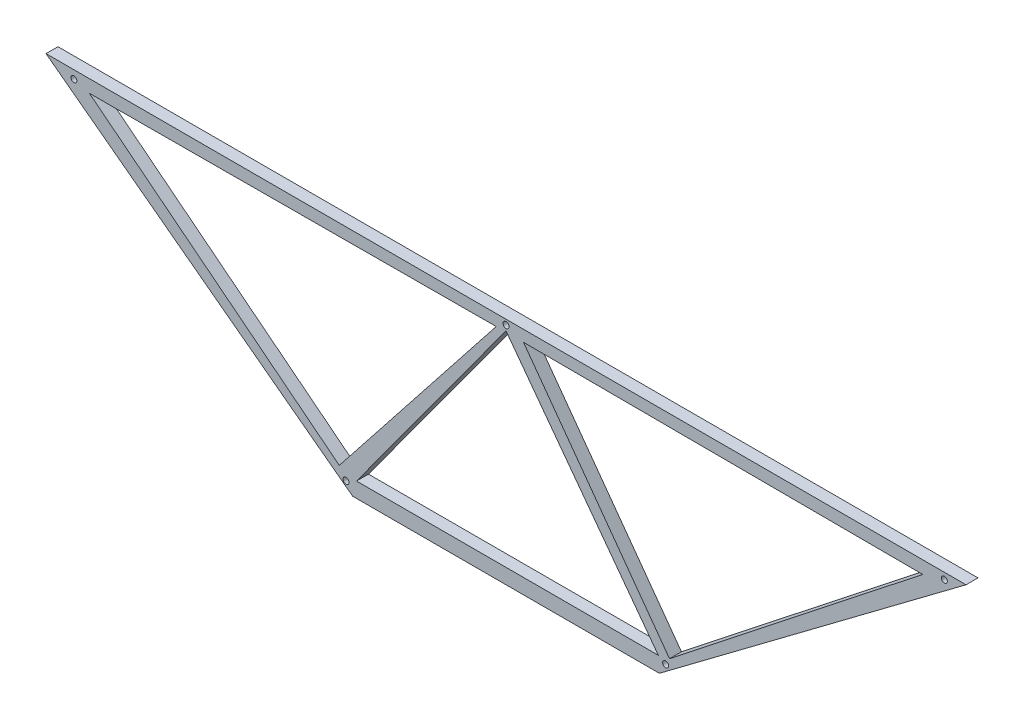
ISO-10303-21;
HEADER;
FILE_DESCRIPTION(('STEP AP214'),'2;1');
FILE_NAME('part.step','',(''),(''),'','','');
FILE_SCHEMA(('AUTOMOTIVE_DESIGN { 1 0 10303 214 1 1 1 1 }'));
ENDSEC;
DATA;
#1=APPLICATION_CONTEXT('core data for automotive mechanical design processes');
#2=APPLICATION_PROTOCOL_DEFINITION('international standard','automotive_design',2000,#1);
#3=PRODUCT_CONTEXT('',#1,'mechanical');
#4=PRODUCT('Part','Part','',(#3));
#5=PRODUCT_RELATED_PRODUCT_CATEGORY('part','',(#4));
#6=PRODUCT_DEFINITION_FORMATION('','',#4);
#7=PRODUCT_DEFINITION_CONTEXT('part definition',#1,'design');
#8=PRODUCT_DEFINITION('design','',#6,#7);
#9=PRODUCT_DEFINITION_SHAPE('','',#8);
#10=(LENGTH_UNIT() NAMED_UNIT(*) SI_UNIT(.MILLI.,.METRE.));
#11=(NAMED_UNIT(*) PLANE_ANGLE_UNIT() SI_UNIT($,.RADIAN.));
#12=(NAMED_UNIT(*) SI_UNIT($,.STERADIAN.) SOLID_ANGLE_UNIT());
#13=UNCERTAINTY_MEASURE_WITH_UNIT(LENGTH_MEASURE(1.E-05),#10,'distance_accuracy_value','');
#14=(GEOMETRIC_REPRESENTATION_CONTEXT(3) GLOBAL_UNCERTAINTY_ASSIGNED_CONTEXT((#13)) GLOBAL_UNIT_ASSIGNED_CONTEXT((#10,
#11,#12)) REPRESENTATION_CONTEXT('',''));
#15=CARTESIAN_POINT('',(0.,0.,0.));
#16=DIRECTION('',(0.,0.,1.));
#17=DIRECTION('',(1.,0.,0.));
#18=AXIS2_PLACEMENT_3D('',#15,#16,#17);
#19=CARTESIAN_POINT('',(200.,-1.02726413272794E-13,15.61));
#20=DIRECTION('',(-0.600000000000001,0.8,0.));
#21=DIRECTION('',(-0.8,-0.600000000000001,0.));
#22=AXIS2_PLACEMENT_3D('',#19,#20,#21);
#23=PLANE('',#22);
#24=DIRECTION('',(0.8,0.6,0.));
#25=VECTOR('',#24,1.);
#26=CARTESIAN_POINT('',(200.,-1.02726413272794E-13,0.));
#27=LINE('',#26,#25);
#28=CARTESIAN_POINT('',(200.,-1.02726413272794E-13,0.));
#29=VERTEX_POINT('',#28);
#30=CARTESIAN_POINT('',(600.,300.,0.));
#31=VERTEX_POINT('',#30);
#32=EDGE_CURVE('E209',#29,#31,#27,.T.);
#33=ORIENTED_EDGE('',*,*,#32,.T.);
#34=DIRECTION('',(0.,0.,-1.));
#35=VECTOR('',#34,1.);
#36=CARTESIAN_POINT('',(600.,300.,15.61));
#37=LINE('',#36,#35);
#38=CARTESIAN_POINT('',(600.,300.,15.61));
#39=VERTEX_POINT('',#38);
#40=EDGE_CURVE('E11',#39,#31,#37,.T.);
#41=ORIENTED_EDGE('',*,*,#40,.F.);
#42=DIRECTION('',(0.8,0.6,0.));
#43=VECTOR('',#42,1.);
#44=CARTESIAN_POINT('',(200.,-1.02726413272794E-13,15.61));
#45=LINE('',#44,#43);
#46=CARTESIAN_POINT('',(200.,-1.02726413272794E-13,15.61));
#47=VERTEX_POINT('',#46);
#48=EDGE_CURVE('E211',#47,#39,#45,.T.);
#49=ORIENTED_EDGE('',*,*,#48,.F.);
#50=DIRECTION('',(0.,0.,-1.));
#51=VECTOR('',#50,1.);
#52=CARTESIAN_POINT('',(200.,-1.02726413272794E-13,15.61));
#53=LINE('',#52,#51);
#54=EDGE_CURVE('E223',#47,#29,#53,.T.);
#55=ORIENTED_EDGE('',*,*,#54,.T.);
#56=EDGE_LOOP('',(#33,#41,#49,#55));
#57=FACE_BOUND('',#56,.T.);
#58=ADVANCED_FACE('F39',(#57),#23,.F.);
#59=CARTESIAN_POINT('',(600.,300.,15.61));
#60=DIRECTION('',(0.,-1.,0.));
#61=DIRECTION('',(1.,0.,0.));
#62=AXIS2_PLACEMENT_3D('',#59,#60,#61);
#63=PLANE('',#62);
#64=DIRECTION('',(-1.,0.,0.));
#65=VECTOR('',#64,1.);
#66=CARTESIAN_POINT('',(600.,300.,0.));
#67=LINE('',#66,#65);
#68=CARTESIAN_POINT('',(-600.,300.,0.));
#69=VERTEX_POINT('',#68);
#70=EDGE_CURVE('E227',#31,#69,#67,.T.);
#71=ORIENTED_EDGE('',*,*,#70,.T.);
#72=DIRECTION('',(0.,0.,-1.));
#73=VECTOR('',#72,1.);
#74=CARTESIAN_POINT('',(-600.,300.,15.61));
#75=LINE('',#74,#73);
#76=CARTESIAN_POINT('',(-600.,300.,15.61));
#77=VERTEX_POINT('',#76);
#78=EDGE_CURVE('E46',#77,#69,#75,.T.);
#79=ORIENTED_EDGE('',*,*,#78,.F.);
#80=DIRECTION('',(-1.,0.,0.));
#81=VECTOR('',#80,1.);
#82=CARTESIAN_POINT('',(600.,300.,15.61));
#83=LINE('',#82,#81);
#84=EDGE_CURVE('E219',#39,#77,#83,.T.);
#85=ORIENTED_EDGE('',*,*,#84,.F.);
#86=ORIENTED_EDGE('',*,*,#40,.T.);
#87=EDGE_LOOP('',(#71,#79,#85,#86));
#88=FACE_BOUND('',#87,.T.);
#89=ADVANCED_FACE('F257',(#88),#63,.F.);
#90=CARTESIAN_POINT('',(-600.,300.,15.61));
#91=DIRECTION('',(0.6,0.8,0.));
#92=DIRECTION('',(-0.8,0.6,0.));
#93=AXIS2_PLACEMENT_3D('',#90,#91,#92);
#94=PLANE('',#93);
#95=DIRECTION('',(0.8,-0.6,0.));
#96=VECTOR('',#95,1.);
#97=CARTESIAN_POINT('',(-600.,300.,0.));
#98=LINE('',#97,#96);
#99=CARTESIAN_POINT('',(-200.,0.,0.));
#100=VERTEX_POINT('',#99);
#101=EDGE_CURVE('E230',#69,#100,#98,.T.);
#102=ORIENTED_EDGE('',*,*,#101,.T.);
#103=DIRECTION('',(0.,0.,-1.));
#104=VECTOR('',#103,1.);
#105=CARTESIAN_POINT('',(-200.,0.,15.61));
#106=LINE('',#105,#104);
#107=CARTESIAN_POINT('',(-200.,0.,15.61));
#108=VERTEX_POINT('',#107);
#109=EDGE_CURVE('E234',#108,#100,#106,.T.);
#110=ORIENTED_EDGE('',*,*,#109,.F.);
#111=DIRECTION('',(0.8,-0.6,0.));
#112=VECTOR('',#111,1.);
#113=CARTESIAN_POINT('',(-600.,300.,15.61));
#114=LINE('',#113,#112);
#115=EDGE_CURVE('E216',#77,#108,#114,.T.);
#116=ORIENTED_EDGE('',*,*,#115,.F.);
#117=ORIENTED_EDGE('',*,*,#78,.T.);
#118=EDGE_LOOP('',(#102,#110,#116,#117));
#119=FACE_BOUND('',#118,.T.);
#120=ADVANCED_FACE('F241',(#119),#94,.F.);
#121=CARTESIAN_POINT('',(-200.,0.,15.61));
#122=DIRECTION('',(0.,1.,0.));
#123=DIRECTION('',(-1.,0.,0.));
#124=AXIS2_PLACEMENT_3D('',#121,#122,#123);
#125=PLANE('',#124);
#126=DIRECTION('',(1.,0.,0.));
#127=VECTOR('',#126,1.);
#128=CARTESIAN_POINT('',(-200.,0.,0.));
#129=LINE('',#128,#127);
#130=EDGE_CURVE('E217',#100,#29,#129,.T.);
#131=ORIENTED_EDGE('',*,*,#130,.T.);
#132=ORIENTED_EDGE('',*,*,#54,.F.);
#133=DIRECTION('',(1.,0.,0.));
#134=VECTOR('',#133,1.);
#135=CARTESIAN_POINT('',(-200.,0.,15.61));
#136=LINE('',#135,#134);
#137=EDGE_CURVE('E221',#108,#47,#136,.T.);
#138=ORIENTED_EDGE('',*,*,#137,.F.);
#139=ORIENTED_EDGE('',*,*,#109,.T.);
#140=EDGE_LOOP('',(#131,#132,#138,#139));
#141=FACE_BOUND('',#140,.T.);
#142=ADVANCED_FACE('F248',(#141),#125,.F.);
#143=CARTESIAN_POINT('',(0.,0.,15.61));
#144=DIRECTION('',(0.,0.,-1.));
#145=DIRECTION('',(-1.,0.,0.));
#146=AXIS2_PLACEMENT_3D('',#143,#144,#145);
#147=PLANE('',#146);
#148=CARTESIAN_POINT('',(-563.626982451195,289.376274745277,15.61));
#149=DIRECTION('',(0.,0.,1.));
#150=DIRECTION('',(1.,0.,0.));
#151=AXIS2_PLACEMENT_3D('',#148,#149,#150);
#152=CIRCLE('',#151,3.89999999999983);
#153=CARTESIAN_POINT('',(-559.726982451196,289.376274745277,15.61));
#154=VERTEX_POINT('',#153);
#155=EDGE_CURVE('E330',#154,#154,#152,.T.);
#156=ORIENTED_EDGE('',*,*,#155,.F.);
#157=EDGE_LOOP('',(#156));
#158=FACE_BOUND('',#157,.T.);
#159=CARTESIAN_POINT('',(-208.717094574376,13.0755215010745,15.61));
#160=DIRECTION('',(0.,0.,1.));
#161=DIRECTION('',(1.,0.,0.));
#162=AXIS2_PLACEMENT_3D('',#159,#160,#161);
#163=CIRCLE('',#162,3.9);
#164=CARTESIAN_POINT('',(-204.817094574376,13.0755215010745,15.61));
#165=VERTEX_POINT('',#164);
#166=EDGE_CURVE('E344',#165,#165,#163,.T.);
#167=ORIENTED_EDGE('',*,*,#166,.F.);
#168=EDGE_LOOP('',(#167));
#169=FACE_BOUND('',#168,.T.);
#170=CARTESIAN_POINT('',(571.769930614709,291.724280099086,15.61));
#171=DIRECTION('',(0.,0.,1.));
#172=DIRECTION('',(1.,0.,0.));
#173=AXIS2_PLACEMENT_3D('',#170,#171,#172);
#174=CIRCLE('',#173,3.90000000000006);
#175=CARTESIAN_POINT('',(575.669930614709,291.724280099086,15.61));
#176=VERTEX_POINT('',#175);
#177=EDGE_CURVE('E340',#176,#176,#174,.T.);
#178=ORIENTED_EDGE('',*,*,#177,.F.);
#179=EDGE_LOOP('',(#178));
#180=FACE_BOUND('',#179,.T.);
#181=CARTESIAN_POINT('',(208.154539122281,14.2672478103547,15.61));
#182=DIRECTION('',(0.,0.,1.));
#183=DIRECTION('',(1.,0.,0.));
#184=AXIS2_PLACEMENT_3D('',#181,#182,#183);
#185=CIRCLE('',#184,3.9);
#186=CARTESIAN_POINT('',(212.054539122281,14.2672478103547,15.61));
#187=VERTEX_POINT('',#186);
#188=EDGE_CURVE('E346',#187,#187,#185,.T.);
#189=ORIENTED_EDGE('',*,*,#188,.F.);
#190=EDGE_LOOP('',(#189));
#191=FACE_BOUND('',#190,.T.);
#192=CARTESIAN_POINT('',(-1.08576890578373E-13,293.392106369885,15.61));
#193=DIRECTION('',(0.,0.,1.));
#194=DIRECTION('',(1.,0.,0.));
#195=AXIS2_PLACEMENT_3D('',#192,#193,#194);
#196=CIRCLE('',#195,3.9);
#197=CARTESIAN_POINT('',(3.8999999999999,293.392106369885,15.61));
#198=VERTEX_POINT('',#197);
#199=EDGE_CURVE('E326',#198,#198,#196,.T.);
#200=ORIENTED_EDGE('',*,*,#199,.F.);
#201=EDGE_LOOP('',(#200));
#202=FACE_BOUND('',#201,.T.);
#203=DIRECTION('',(0.619658846601666,0.784871272138491,0.));
#204=VECTOR('',#203,1.);
#205=CARTESIAN_POINT('',(-217.434189148752,26.151043002149,15.61));
#206=LINE('',#205,#204);
#207=CARTESIAN_POINT('',(-217.434189148752,26.151043002149,15.61));
#208=VERTEX_POINT('',#207);
#209=CARTESIAN_POINT('',(-12.8102827276835,285.331439801828,15.61));
#210=VERTEX_POINT('',#209);
#211=EDGE_CURVE('E155',#208,#210,#206,.T.);
#212=ORIENTED_EDGE('',*,*,#211,.F.);
#213=DIRECTION('',(0.784871272138491,-0.619658846601666,0.));
#214=VECTOR('',#213,1.);
#215=CARTESIAN_POINT('',(-543.331948451676,283.448560198172,15.61));
#216=LINE('',#215,#214);
#217=CARTESIAN_POINT('',(-543.331948451676,283.448560198172,15.61));
#218=VERTEX_POINT('',#217);
#219=EDGE_CURVE('E52',#218,#208,#216,.T.);
#220=ORIENTED_EDGE('',*,*,#219,.F.);
#221=DIRECTION('',(-0.999993701969575,-0.00354908737356482,0.));
#222=VECTOR('',#221,1.);
#223=CARTESIAN_POINT('',(-12.8102827276835,285.331439801828,15.61));
#224=LINE('',#223,#222);
#225=EDGE_CURVE('E153',#210,#218,#224,.T.);
#226=ORIENTED_EDGE('',*,*,#225,.F.);
#227=EDGE_LOOP('',(#212,#220,#226));
#228=FACE_BOUND('',#227,.T.);
#229=DIRECTION('',(0.78543290200862,0.61894681228868,0.));
#230=VECTOR('',#229,1.);
#231=CARTESIAN_POINT('',(213.236522938282,23.1587279276047,15.61));
#232=LINE('',#231,#230);
#233=CARTESIAN_POINT('',(213.236522938282,23.1587279276048,15.61));
#234=VERTEX_POINT('',#233);
#235=CARTESIAN_POINT('',(543.539861229419,283.448560198172,15.61));
#236=VERTEX_POINT('',#235);
#237=EDGE_CURVE('E178',#234,#236,#232,.T.);
#238=ORIENTED_EDGE('',*,*,#237,.F.);
#239=DIRECTION('',(0.587591805673342,-0.809157506240622,0.));
#240=VECTOR('',#239,1.);
#241=CARTESIAN_POINT('',(22.8526533203921,285.331439801828,15.61));
#242=LINE('',#241,#240);
#243=CARTESIAN_POINT('',(22.8526533203921,285.331439801828,15.61));
#244=VERTEX_POINT('',#243);
#245=EDGE_CURVE('E62',#244,#234,#242,.T.);
#246=ORIENTED_EDGE('',*,*,#245,.F.);
#247=DIRECTION('',(-0.999993461817624,0.00361611974415042,0.));
#248=VECTOR('',#247,1.);
#249=CARTESIAN_POINT('',(543.539861229419,283.448560198172,15.61));
#250=LINE('',#249,#248);
#251=EDGE_CURVE('E174',#236,#244,#250,.T.);
#252=ORIENTED_EDGE('',*,*,#251,.F.);
#253=EDGE_LOOP('',(#238,#246,#252));
#254=FACE_BOUND('',#253,.T.);
#255=DIRECTION('',(1.,0.,0.));
#256=VECTOR('',#255,1.);
#257=CARTESIAN_POINT('',(-195.,19.6783080925826,15.61));
#258=LINE('',#257,#256);
#259=CARTESIAN_POINT('',(-195.,19.6783080925826,15.61));
#260=VERTEX_POINT('',#259);
#261=CARTESIAN_POINT('',(198.687304149753,19.6783080925826,15.61));
#262=VERTEX_POINT('',#261);
#263=EDGE_CURVE('E201',#260,#262,#258,.T.);
#264=ORIENTED_EDGE('',*,*,#263,.F.);
#265=DIRECTION('',(-0.589636534369051,-0.807668717567577,0.));
#266=VECTOR('',#265,1.);
#267=CARTESIAN_POINT('',(-1.06131478694231E-13,286.78421273977,15.61));
#268=LINE('',#267,#266);
#269=CARTESIAN_POINT('',(-1.06131478694231E-13,286.78421273977,15.61));
#270=VERTEX_POINT('',#269);
#271=EDGE_CURVE('E164',#270,#260,#268,.T.);
#272=ORIENTED_EDGE('',*,*,#271,.F.);
#273=DIRECTION('',(-0.596838342494344,0.802361510124087,0.));
#274=VECTOR('',#273,1.);
#275=CARTESIAN_POINT('',(198.687304149753,19.6783080925826,15.61));
#276=LINE('',#275,#274);
#277=EDGE_CURVE('E191',#262,#270,#276,.T.);
#278=ORIENTED_EDGE('',*,*,#277,.F.);
#279=EDGE_LOOP('',(#264,#272,#278));
#280=FACE_BOUND('',#279,.T.);
#281=ORIENTED_EDGE('',*,*,#48,.T.);
#282=ORIENTED_EDGE('',*,*,#84,.T.);
#283=ORIENTED_EDGE('',*,*,#115,.T.);
#284=ORIENTED_EDGE('',*,*,#137,.T.);
#285=EDGE_LOOP('',(#281,#282,#283,#284));
#286=FACE_BOUND('',#285,.T.);
#287=ADVANCED_FACE('F253',(#158,#169,#180,#191,#202,#228,#254,#280,#286),#147,.F.);
#288=CARTESIAN_POINT('',(0.,0.,0.));
#289=DIRECTION('',(0.,0.,-1.));
#290=DIRECTION('',(-1.,0.,0.));
#291=AXIS2_PLACEMENT_3D('',#288,#289,#290);
#292=PLANE('',#291);
#293=CARTESIAN_POINT('',(-563.626982451195,289.376274745277,0.));
#294=DIRECTION('',(0.,0.,1.));
#295=DIRECTION('',(1.,0.,0.));
#296=AXIS2_PLACEMENT_3D('',#293,#294,#295);
#297=CIRCLE('',#296,3.89999999999983);
#298=CARTESIAN_POINT('',(-559.726982451196,289.376274745277,0.));
#299=VERTEX_POINT('',#298);
#300=EDGE_CURVE('E172',#299,#299,#297,.T.);
#301=ORIENTED_EDGE('',*,*,#300,.T.);
#302=EDGE_LOOP('',(#301));
#303=FACE_BOUND('',#302,.T.);
#304=CARTESIAN_POINT('',(-208.717094574376,13.0755215010745,0.));
#305=DIRECTION('',(0.,0.,1.));
#306=DIRECTION('',(1.,0.,0.));
#307=AXIS2_PLACEMENT_3D('',#304,#305,#306);
#308=CIRCLE('',#307,3.9);
#309=CARTESIAN_POINT('',(-204.817094574376,13.0755215010745,0.));
#310=VERTEX_POINT('',#309);
#311=EDGE_CURVE('E348',#310,#310,#308,.T.);
#312=ORIENTED_EDGE('',*,*,#311,.T.);
#313=EDGE_LOOP('',(#312));
#314=FACE_BOUND('',#313,.T.);
#315=CARTESIAN_POINT('',(571.769930614709,291.724280099086,0.));
#316=DIRECTION('',(0.,0.,1.));
#317=DIRECTION('',(1.,0.,0.));
#318=AXIS2_PLACEMENT_3D('',#315,#316,#317);
#319=CIRCLE('',#318,3.90000000000006);
#320=CARTESIAN_POINT('',(575.669930614709,291.724280099086,0.));
#321=VERTEX_POINT('',#320);
#322=EDGE_CURVE('E338',#321,#321,#319,.T.);
#323=ORIENTED_EDGE('',*,*,#322,.T.);
#324=EDGE_LOOP('',(#323));
#325=FACE_BOUND('',#324,.T.);
#326=CARTESIAN_POINT('',(208.154539122281,14.2672478103547,0.));
#327=DIRECTION('',(0.,0.,1.));
#328=DIRECTION('',(1.,0.,0.));
#329=AXIS2_PLACEMENT_3D('',#326,#327,#328);
#330=CIRCLE('',#329,3.9);
#331=CARTESIAN_POINT('',(212.054539122281,14.2672478103547,0.));
#332=VERTEX_POINT('',#331);
#333=EDGE_CURVE('E156',#332,#332,#330,.T.);
#334=ORIENTED_EDGE('',*,*,#333,.T.);
#335=EDGE_LOOP('',(#334));
#336=FACE_BOUND('',#335,.T.);
#337=CARTESIAN_POINT('',(-1.08576890578373E-13,293.392106369885,0.));
#338=DIRECTION('',(0.,0.,1.));
#339=DIRECTION('',(1.,0.,0.));
#340=AXIS2_PLACEMENT_3D('',#337,#338,#339);
#341=CIRCLE('',#340,3.9);
#342=CARTESIAN_POINT('',(3.8999999999999,293.392106369885,0.));
#343=VERTEX_POINT('',#342);
#344=EDGE_CURVE('E333',#343,#343,#341,.T.);
#345=ORIENTED_EDGE('',*,*,#344,.T.);
#346=EDGE_LOOP('',(#345));
#347=FACE_BOUND('',#346,.T.);
#348=DIRECTION('',(0.784871272138491,-0.619658846601666,0.));
#349=VECTOR('',#348,1.);
#350=CARTESIAN_POINT('',(-543.331948451676,283.448560198172,0.));
#351=LINE('',#350,#349);
#352=CARTESIAN_POINT('',(-543.331948451676,283.448560198172,0.));
#353=VERTEX_POINT('',#352);
#354=CARTESIAN_POINT('',(-217.434189148752,26.151043002149,0.));
#355=VERTEX_POINT('',#354);
#356=EDGE_CURVE('E131',#353,#355,#351,.T.);
#357=ORIENTED_EDGE('',*,*,#356,.T.);
#358=DIRECTION('',(0.619658846601666,0.784871272138491,0.));
#359=VECTOR('',#358,1.);
#360=CARTESIAN_POINT('',(-217.434189148752,26.151043002149,0.));
#361=LINE('',#360,#359);
#362=CARTESIAN_POINT('',(-12.8102827276836,285.331439801828,0.));
#363=VERTEX_POINT('',#362);
#364=EDGE_CURVE('E143',#355,#363,#361,.T.);
#365=ORIENTED_EDGE('',*,*,#364,.T.);
#366=DIRECTION('',(-0.999993701969575,-0.00354908737356482,0.));
#367=VECTOR('',#366,1.);
#368=CARTESIAN_POINT('',(-12.8102827276835,285.331439801828,0.));
#369=LINE('',#368,#367);
#370=EDGE_CURVE('E142',#363,#353,#369,.T.);
#371=ORIENTED_EDGE('',*,*,#370,.T.);
#372=EDGE_LOOP('',(#357,#365,#371));
#373=FACE_BOUND('',#372,.T.);
#374=DIRECTION('',(0.587591805673342,-0.809157506240622,0.));
#375=VECTOR('',#374,1.);
#376=CARTESIAN_POINT('',(22.8526533203921,285.331439801828,0.));
#377=LINE('',#376,#375);
#378=CARTESIAN_POINT('',(22.8526533203921,285.331439801828,0.));
#379=VERTEX_POINT('',#378);
#380=CARTESIAN_POINT('',(213.236522938282,23.1587279276047,0.));
#381=VERTEX_POINT('',#380);
#382=EDGE_CURVE('E177',#379,#381,#377,.T.);
#383=ORIENTED_EDGE('',*,*,#382,.T.);
#384=DIRECTION('',(0.78543290200862,0.61894681228868,0.));
#385=VECTOR('',#384,1.);
#386=CARTESIAN_POINT('',(213.236522938282,23.1587279276047,0.));
#387=LINE('',#386,#385);
#388=CARTESIAN_POINT('',(543.539861229419,283.448560198172,0.));
#389=VERTEX_POINT('',#388);
#390=EDGE_CURVE('E184',#381,#389,#387,.T.);
#391=ORIENTED_EDGE('',*,*,#390,.T.);
#392=DIRECTION('',(-0.999993461817624,0.00361611974415042,0.));
#393=VECTOR('',#392,1.);
#394=CARTESIAN_POINT('',(543.539861229419,283.448560198172,0.));
#395=LINE('',#394,#393);
#396=EDGE_CURVE('E169',#389,#379,#395,.T.);
#397=ORIENTED_EDGE('',*,*,#396,.T.);
#398=EDGE_LOOP('',(#383,#391,#397));
#399=FACE_BOUND('',#398,.T.);
#400=DIRECTION('',(-0.589636534369051,-0.807668717567577,0.));
#401=VECTOR('',#400,1.);
#402=CARTESIAN_POINT('',(-1.06131478694231E-13,286.78421273977,0.));
#403=LINE('',#402,#401);
#404=CARTESIAN_POINT('',(-1.06131478694231E-13,286.78421273977,0.));
#405=VERTEX_POINT('',#404);
#406=CARTESIAN_POINT('',(-195.,19.6783080925826,0.));
#407=VERTEX_POINT('',#406);
#408=EDGE_CURVE('E188',#405,#407,#403,.T.);
#409=ORIENTED_EDGE('',*,*,#408,.T.);
#410=DIRECTION('',(1.,0.,0.));
#411=VECTOR('',#410,1.);
#412=CARTESIAN_POINT('',(-195.,19.6783080925826,0.));
#413=LINE('',#412,#411);
#414=CARTESIAN_POINT('',(198.687304149753,19.6783080925826,0.));
#415=VERTEX_POINT('',#414);
#416=EDGE_CURVE('E194',#407,#415,#413,.T.);
#417=ORIENTED_EDGE('',*,*,#416,.T.);
#418=DIRECTION('',(-0.596838342494344,0.802361510124087,0.));
#419=VECTOR('',#418,1.);
#420=CARTESIAN_POINT('',(198.687304149753,19.6783080925826,0.));
#421=LINE('',#420,#419);
#422=EDGE_CURVE('E199',#415,#405,#421,.T.);
#423=ORIENTED_EDGE('',*,*,#422,.T.);
#424=EDGE_LOOP('',(#409,#417,#423));
#425=FACE_BOUND('',#424,.T.);
#426=ORIENTED_EDGE('',*,*,#32,.F.);
#427=ORIENTED_EDGE('',*,*,#130,.F.);
#428=ORIENTED_EDGE('',*,*,#101,.F.);
#429=ORIENTED_EDGE('',*,*,#70,.F.);
#430=EDGE_LOOP('',(#426,#427,#428,#429));
#431=FACE_BOUND('',#430,.T.);
#432=ADVANCED_FACE('F146',(#303,#314,#325,#336,#347,#373,#399,#425,#431),#292,.T.);
#433=CARTESIAN_POINT('',(-1.06131478694231E-13,286.78421273977,0.));
#434=DIRECTION('',(-0.807668717567578,0.589636534369051,0.));
#435=DIRECTION('',(-0.589636534369051,-0.807668717567578,0.));
#436=AXIS2_PLACEMENT_3D('',#433,#434,#435);
#437=PLANE('',#436);
#438=ORIENTED_EDGE('',*,*,#271,.T.);
#439=DIRECTION('',(0.,0.,1.));
#440=VECTOR('',#439,1.);
#441=CARTESIAN_POINT('',(-195.,19.6783080925826,0.));
#442=LINE('',#441,#440);
#443=EDGE_CURVE('E196',#407,#260,#442,.T.);
#444=ORIENTED_EDGE('',*,*,#443,.F.);
#445=ORIENTED_EDGE('',*,*,#408,.F.);
#446=DIRECTION('',(0.,0.,1.));
#447=VECTOR('',#446,1.);
#448=CARTESIAN_POINT('',(-1.06131478694231E-13,286.78421273977,0.));
#449=LINE('',#448,#447);
#450=EDGE_CURVE('E210',#405,#270,#449,.T.);
#451=ORIENTED_EDGE('',*,*,#450,.T.);
#452=EDGE_LOOP('',(#438,#444,#445,#451));
#453=FACE_BOUND('',#452,.T.);
#454=ADVANCED_FACE('F270',(#453),#437,.F.);
#455=CARTESIAN_POINT('',(198.687304149753,19.6783080925826,0.));
#456=DIRECTION('',(0.802361510124087,0.596838342494344,0.));
#457=DIRECTION('',(-0.596838342494344,0.802361510124087,0.));
#458=AXIS2_PLACEMENT_3D('',#455,#456,#457);
#459=PLANE('',#458);
#460=ORIENTED_EDGE('',*,*,#277,.T.);
#461=ORIENTED_EDGE('',*,*,#450,.F.);
#462=ORIENTED_EDGE('',*,*,#422,.F.);
#463=DIRECTION('',(0.,0.,1.));
#464=VECTOR('',#463,1.);
#465=CARTESIAN_POINT('',(198.687304149753,19.6783080925826,0.));
#466=LINE('',#465,#464);
#467=EDGE_CURVE('E208',#415,#262,#466,.T.);
#468=ORIENTED_EDGE('',*,*,#467,.T.);
#469=EDGE_LOOP('',(#460,#461,#462,#468));
#470=FACE_BOUND('',#469,.T.);
#471=ADVANCED_FACE('F273',(#470),#459,.F.);
#472=CARTESIAN_POINT('',(-195.,19.6783080925826,0.));
#473=DIRECTION('',(0.,-1.,0.));
#474=DIRECTION('',(1.,0.,0.));
#475=AXIS2_PLACEMENT_3D('',#472,#473,#474);
#476=PLANE('',#475);
#477=ORIENTED_EDGE('',*,*,#263,.T.);
#478=ORIENTED_EDGE('',*,*,#467,.F.);
#479=ORIENTED_EDGE('',*,*,#416,.F.);
#480=ORIENTED_EDGE('',*,*,#443,.T.);
#481=EDGE_LOOP('',(#477,#478,#479,#480));
#482=FACE_BOUND('',#481,.T.);
#483=ADVANCED_FACE('F280',(#482),#476,.F.);
#484=CARTESIAN_POINT('',(22.8526533203921,285.331439801828,0.));
#485=DIRECTION('',(-0.809157506240622,-0.587591805673342,0.));
#486=DIRECTION('',(0.587591805673342,-0.809157506240622,0.));
#487=AXIS2_PLACEMENT_3D('',#484,#485,#486);
#488=PLANE('',#487);
#489=ORIENTED_EDGE('',*,*,#245,.T.);
#490=DIRECTION('',(0.,0.,1.));
#491=VECTOR('',#490,1.);
#492=CARTESIAN_POINT('',(213.236522938282,23.1587279276047,0.));
#493=LINE('',#492,#491);
#494=EDGE_CURVE('E170',#381,#234,#493,.T.);
#495=ORIENTED_EDGE('',*,*,#494,.F.);
#496=ORIENTED_EDGE('',*,*,#382,.F.);
#497=DIRECTION('',(0.,0.,1.));
#498=VECTOR('',#497,1.);
#499=CARTESIAN_POINT('',(22.8526533203921,285.331439801828,0.));
#500=LINE('',#499,#498);
#501=EDGE_CURVE('E175',#379,#244,#500,.T.);
#502=ORIENTED_EDGE('',*,*,#501,.T.);
#503=EDGE_LOOP('',(#489,#495,#496,#502));
#504=FACE_BOUND('',#503,.T.);
#505=ADVANCED_FACE('F278',(#504),#488,.F.);
#506=CARTESIAN_POINT('',(543.539861229419,283.448560198172,0.));
#507=DIRECTION('',(0.00361611974415042,0.999993461817624,0.));
#508=DIRECTION('',(-0.999993461817624,0.00361611974415042,0.));
#509=AXIS2_PLACEMENT_3D('',#506,#507,#508);
#510=PLANE('',#509);
#511=ORIENTED_EDGE('',*,*,#251,.T.);
#512=ORIENTED_EDGE('',*,*,#501,.F.);
#513=ORIENTED_EDGE('',*,*,#396,.F.);
#514=DIRECTION('',(0.,0.,1.));
#515=VECTOR('',#514,1.);
#516=CARTESIAN_POINT('',(543.539861229419,283.448560198172,0.));
#517=LINE('',#516,#515);
#518=EDGE_CURVE('E167',#389,#236,#517,.T.);
#519=ORIENTED_EDGE('',*,*,#518,.T.);
#520=EDGE_LOOP('',(#511,#512,#513,#519));
#521=FACE_BOUND('',#520,.T.);
#522=ADVANCED_FACE('F281',(#521),#510,.F.);
#523=CARTESIAN_POINT('',(213.236522938282,23.1587279276047,0.));
#524=DIRECTION('',(0.61894681228868,-0.78543290200862,0.));
#525=DIRECTION('',(0.78543290200862,0.61894681228868,0.));
#526=AXIS2_PLACEMENT_3D('',#523,#524,#525);
#527=PLANE('',#526);
#528=ORIENTED_EDGE('',*,*,#237,.T.);
#529=ORIENTED_EDGE('',*,*,#518,.F.);
#530=ORIENTED_EDGE('',*,*,#390,.F.);
#531=ORIENTED_EDGE('',*,*,#494,.T.);
#532=EDGE_LOOP('',(#528,#529,#530,#531));
#533=FACE_BOUND('',#532,.T.);
#534=ADVANCED_FACE('F290',(#533),#527,.F.);
#535=CARTESIAN_POINT('',(-543.331948451676,283.448560198172,0.));
#536=DIRECTION('',(-0.619658846601666,-0.784871272138491,0.));
#537=DIRECTION('',(0.784871272138491,-0.619658846601666,0.));
#538=AXIS2_PLACEMENT_3D('',#535,#536,#537);
#539=PLANE('',#538);
#540=ORIENTED_EDGE('',*,*,#219,.T.);
#541=DIRECTION('',(0.,0.,1.));
#542=VECTOR('',#541,1.);
#543=CARTESIAN_POINT('',(-217.434189148752,26.151043002149,0.));
#544=LINE('',#543,#542);
#545=EDGE_CURVE('E133',#355,#208,#544,.T.);
#546=ORIENTED_EDGE('',*,*,#545,.F.);
#547=ORIENTED_EDGE('',*,*,#356,.F.);
#548=DIRECTION('',(0.,0.,1.));
#549=VECTOR('',#548,1.);
#550=CARTESIAN_POINT('',(-543.331948451676,283.448560198172,0.));
#551=LINE('',#550,#549);
#552=EDGE_CURVE('E161',#353,#218,#551,.T.);
#553=ORIENTED_EDGE('',*,*,#552,.T.);
#554=EDGE_LOOP('',(#540,#546,#547,#553));
#555=FACE_BOUND('',#554,.T.);
#556=ADVANCED_FACE('F132',(#555),#539,.F.);
#557=CARTESIAN_POINT('',(-12.8102827276835,285.331439801828,0.));
#558=DIRECTION('',(-0.00354908737356482,0.999993701969575,0.));
#559=DIRECTION('',(-0.999993701969575,-0.00354908737356482,0.));
#560=AXIS2_PLACEMENT_3D('',#557,#558,#559);
#561=PLANE('',#560);
#562=ORIENTED_EDGE('',*,*,#225,.T.);
#563=ORIENTED_EDGE('',*,*,#552,.F.);
#564=ORIENTED_EDGE('',*,*,#370,.F.);
#565=DIRECTION('',(0.,0.,1.));
#566=VECTOR('',#565,1.);
#567=CARTESIAN_POINT('',(-12.8102827276835,285.331439801828,0.));
#568=LINE('',#567,#566);
#569=EDGE_CURVE('E137',#363,#210,#568,.T.);
#570=ORIENTED_EDGE('',*,*,#569,.T.);
#571=EDGE_LOOP('',(#562,#563,#564,#570));
#572=FACE_BOUND('',#571,.T.);
#573=ADVANCED_FACE('F300',(#572),#561,.F.);
#574=CARTESIAN_POINT('',(-217.434189148752,26.151043002149,0.));
#575=DIRECTION('',(0.784871272138491,-0.619658846601666,0.));
#576=DIRECTION('',(0.619658846601666,0.784871272138491,0.));
#577=AXIS2_PLACEMENT_3D('',#574,#575,#576);
#578=PLANE('',#577);
#579=ORIENTED_EDGE('',*,*,#211,.T.);
#580=ORIENTED_EDGE('',*,*,#569,.F.);
#581=ORIENTED_EDGE('',*,*,#364,.F.);
#582=ORIENTED_EDGE('',*,*,#545,.T.);
#583=EDGE_LOOP('',(#579,#580,#581,#582));
#584=FACE_BOUND('',#583,.T.);
#585=ADVANCED_FACE('F147',(#584),#578,.F.);
#586=CARTESIAN_POINT('',(-1.08576890578373E-13,293.392106369885,0.));
#587=DIRECTION('',(0.,0.,1.));
#588=DIRECTION('',(1.,0.,0.));
#589=AXIS2_PLACEMENT_3D('',#586,#587,#588);
#590=CYLINDRICAL_SURFACE('',#589,3.9);
#591=ORIENTED_EDGE('',*,*,#344,.F.);
#592=EDGE_LOOP('',(#591));
#593=FACE_BOUND('',#592,.T.);
#594=ORIENTED_EDGE('',*,*,#199,.T.);
#595=EDGE_LOOP('',(#594));
#596=FACE_BOUND('',#595,.T.);
#597=ADVANCED_FACE('F297',(#593,#596),#590,.F.);
#598=CARTESIAN_POINT('',(208.154539122281,14.2672478103547,0.));
#599=DIRECTION('',(0.,0.,1.));
#600=DIRECTION('',(1.,0.,0.));
#601=AXIS2_PLACEMENT_3D('',#598,#599,#600);
#602=CYLINDRICAL_SURFACE('',#601,3.9);
#603=ORIENTED_EDGE('',*,*,#333,.F.);
#604=EDGE_LOOP('',(#603));
#605=FACE_BOUND('',#604,.T.);
#606=ORIENTED_EDGE('',*,*,#188,.T.);
#607=EDGE_LOOP('',(#606));
#608=FACE_BOUND('',#607,.T.);
#609=ADVANCED_FACE('F302',(#605,#608),#602,.F.);
#610=CARTESIAN_POINT('',(571.769930614709,291.724280099086,0.));
#611=DIRECTION('',(0.,0.,1.));
#612=DIRECTION('',(1.,0.,0.));
#613=AXIS2_PLACEMENT_3D('',#610,#611,#612);
#614=CYLINDRICAL_SURFACE('',#613,3.90000000000006);
#615=ORIENTED_EDGE('',*,*,#322,.F.);
#616=EDGE_LOOP('',(#615));
#617=FACE_BOUND('',#616,.T.);
#618=ORIENTED_EDGE('',*,*,#177,.T.);
#619=EDGE_LOOP('',(#618));
#620=FACE_BOUND('',#619,.T.);
#621=ADVANCED_FACE('F310',(#617,#620),#614,.F.);
#622=CARTESIAN_POINT('',(-208.717094574376,13.0755215010745,0.));
#623=DIRECTION('',(0.,0.,1.));
#624=DIRECTION('',(1.,0.,0.));
#625=AXIS2_PLACEMENT_3D('',#622,#623,#624);
#626=CYLINDRICAL_SURFACE('',#625,3.9);
#627=ORIENTED_EDGE('',*,*,#311,.F.);
#628=EDGE_LOOP('',(#627));
#629=FACE_BOUND('',#628,.T.);
#630=ORIENTED_EDGE('',*,*,#166,.T.);
#631=EDGE_LOOP('',(#630));
#632=FACE_BOUND('',#631,.T.);
#633=ADVANCED_FACE('F315',(#629,#632),#626,.F.);
#634=CARTESIAN_POINT('',(-563.626982451195,289.376274745277,0.));
#635=DIRECTION('',(0.,0.,1.));
#636=DIRECTION('',(1.,0.,0.));
#637=AXIS2_PLACEMENT_3D('',#634,#635,#636);
#638=CYLINDRICAL_SURFACE('',#637,3.89999999999983);
#639=ORIENTED_EDGE('',*,*,#300,.F.);
#640=EDGE_LOOP('',(#639));
#641=FACE_BOUND('',#640,.T.);
#642=ORIENTED_EDGE('',*,*,#155,.T.);
#643=EDGE_LOOP('',(#642));
#644=FACE_BOUND('',#643,.T.);
#645=ADVANCED_FACE('F314',(#641,#644),#638,.F.);
#646=CLOSED_SHELL('',(#58,#89,#120,#142,#287,#432,#454,#471,#483,#505,#522,#534,#556,#573,#585,
#597,#609,#621,#633,#645));
#647=MANIFOLD_SOLID_BREP('B2',#646);
#648=ADVANCED_BREP_SHAPE_REPRESENTATION('',(#18,#647),#14);
#649=SHAPE_DEFINITION_REPRESENTATION(#9,#648);
ENDSEC;
END-ISO-10303-21;
